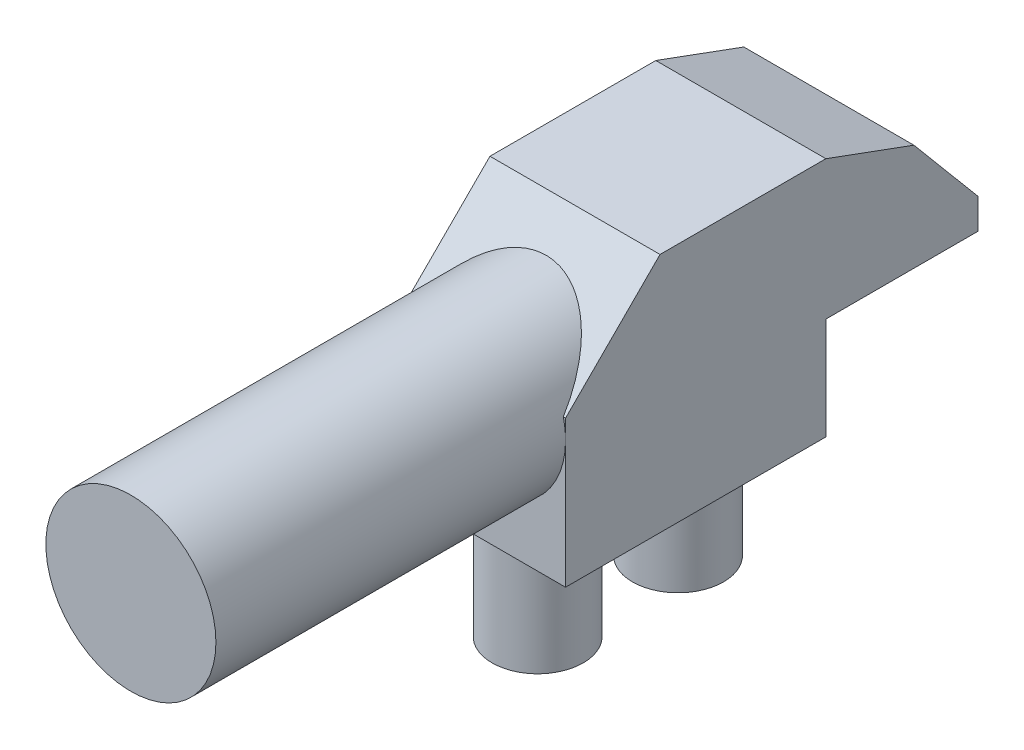
ISO-10303-21;
HEADER;
FILE_DESCRIPTION(('STEP AP214'),'2;1');
FILE_NAME('part.step','',(''),(''),'','','');
FILE_SCHEMA(('AUTOMOTIVE_DESIGN { 1 0 10303 214 1 1 1 1 }'));
ENDSEC;
DATA;
#1=APPLICATION_CONTEXT('core data for automotive mechanical design processes');
#2=APPLICATION_PROTOCOL_DEFINITION('international standard','automotive_design',2000,#1);
#3=PRODUCT_CONTEXT('',#1,'mechanical');
#4=PRODUCT('Part','Part','',(#3));
#5=PRODUCT_RELATED_PRODUCT_CATEGORY('part','',(#4));
#6=PRODUCT_DEFINITION_FORMATION('','',#4);
#7=PRODUCT_DEFINITION_CONTEXT('part definition',#1,'design');
#8=PRODUCT_DEFINITION('design','',#6,#7);
#9=PRODUCT_DEFINITION_SHAPE('','',#8);
#10=(LENGTH_UNIT() NAMED_UNIT(*) SI_UNIT(.MILLI.,.METRE.));
#11=(NAMED_UNIT(*) PLANE_ANGLE_UNIT() SI_UNIT($,.RADIAN.));
#12=(NAMED_UNIT(*) SI_UNIT($,.STERADIAN.) SOLID_ANGLE_UNIT());
#13=UNCERTAINTY_MEASURE_WITH_UNIT(LENGTH_MEASURE(1.E-05),#10,'distance_accuracy_value','');
#14=(GEOMETRIC_REPRESENTATION_CONTEXT(3) GLOBAL_UNCERTAINTY_ASSIGNED_CONTEXT((#13)) GLOBAL_UNIT_ASSIGNED_CONTEXT((#10,
#11,#12)) REPRESENTATION_CONTEXT('',''));
#15=CARTESIAN_POINT('',(0.,0.,0.));
#16=DIRECTION('',(0.,0.,1.));
#17=DIRECTION('',(1.,0.,0.));
#18=AXIS2_PLACEMENT_3D('',#15,#16,#17);
#19=CARTESIAN_POINT('',(-1.8,-2.69,2.755));
#20=DIRECTION('',(0.,0.,1.));
#21=DIRECTION('',(1.,0.,0.));
#22=AXIS2_PLACEMENT_3D('',#19,#20,#21);
#23=PLANE('',#22);
#24=DIRECTION('',(0.,1.,0.));
#25=VECTOR('',#24,1.);
#26=CARTESIAN_POINT('',(1.8,-2.69,2.755));
#27=LINE('',#26,#25);
#28=CARTESIAN_POINT('',(1.8,0.,2.755));
#29=VERTEX_POINT('',#28);
#30=CARTESIAN_POINT('',(1.8,0.409999999999985,2.755));
#31=VERTEX_POINT('',#30);
#32=EDGE_CURVE('E194',#29,#31,#27,.T.);
#33=ORIENTED_EDGE('',*,*,#32,.T.);
#34=DIRECTION('',(-1.,0.,0.));
#35=VECTOR('',#34,1.);
#36=CARTESIAN_POINT('',(-1.8,0.409999999999985,2.755));
#37=LINE('',#36,#35);
#38=CARTESIAN_POINT('',(1.75268365656784,0.409999999999985,2.755));
#39=VERTEX_POINT('',#38);
#40=EDGE_CURVE('E215',#31,#39,#37,.T.);
#41=ORIENTED_EDGE('',*,*,#40,.T.);
#42=CARTESIAN_POINT('',(0.,0.,2.755));
#43=DIRECTION('',(0.,0.,1.));
#44=DIRECTION('',(1.,0.,0.));
#45=AXIS2_PLACEMENT_3D('',#42,#43,#44);
#46=CIRCLE('',#45,1.8);
#47=EDGE_CURVE('E170',#29,#39,#46,.T.);
#48=ORIENTED_EDGE('',*,*,#47,.F.);
#49=EDGE_LOOP('',(#33,#41,#48));
#50=FACE_BOUND('',#49,.T.);
#51=ADVANCED_FACE('F32',(#50),#23,.T.);
#52=CARTESIAN_POINT('',(-1.75268365656784,0.409999999999985,2.755));
#53=VERTEX_POINT('',#52);
#54=CARTESIAN_POINT('',(-1.8,0.,2.755));
#55=VERTEX_POINT('',#54);
#56=EDGE_CURVE('E165',#53,#55,#46,.T.);
#57=ORIENTED_EDGE('',*,*,#56,.F.);
#58=DIRECTION('',(-1.,0.,0.));
#59=VECTOR('',#58,1.);
#60=CARTESIAN_POINT('',(-1.8,0.409999999999985,2.755));
#61=LINE('',#60,#59);
#62=CARTESIAN_POINT('',(-1.8,0.409999999999985,2.755));
#63=VERTEX_POINT('',#62);
#64=EDGE_CURVE('E47',#53,#63,#61,.T.);
#65=ORIENTED_EDGE('',*,*,#64,.T.);
#66=DIRECTION('',(0.,1.,0.));
#67=VECTOR('',#66,1.);
#68=CARTESIAN_POINT('',(-1.8,-2.69,2.755));
#69=LINE('',#68,#67);
#70=EDGE_CURVE('E198',#55,#63,#69,.T.);
#71=ORIENTED_EDGE('',*,*,#70,.F.);
#72=EDGE_LOOP('',(#57,#65,#71));
#73=FACE_BOUND('',#72,.T.);
#74=ADVANCED_FACE('F236',(#73),#23,.T.);
#75=CARTESIAN_POINT('',(1.8,-2.69,-2.755));
#76=DIRECTION('',(1.,0.,0.));
#77=DIRECTION('',(0.,0.,-1.));
#78=AXIS2_PLACEMENT_3D('',#75,#76,#77);
#79=PLANE('',#78);
#80=DIRECTION('',(0.,0.,-1.));
#81=VECTOR('',#80,1.);
#82=CARTESIAN_POINT('',(1.8,2.41,-2.755));
#83=LINE('',#82,#81);
#84=CARTESIAN_POINT('',(1.8,2.41,0.754999999999965));
#85=VERTEX_POINT('',#84);
#86=CARTESIAN_POINT('',(1.8,2.41,-2.755));
#87=VERTEX_POINT('',#86);
#88=EDGE_CURVE('E169',#85,#87,#83,.T.);
#89=ORIENTED_EDGE('',*,*,#88,.F.);
#90=DIRECTION('',(0.,0.707106781186544,-0.707106781186551));
#91=VECTOR('',#90,1.);
#92=CARTESIAN_POINT('',(1.8,1.61500000000001,1.54999999999996));
#93=LINE('',#92,#91);
#94=EDGE_CURVE('E212',#85,#31,#93,.F.);
#95=ORIENTED_EDGE('',*,*,#94,.T.);
#96=ORIENTED_EDGE('',*,*,#32,.F.);
#97=CARTESIAN_POINT('',(1.8,-2.69,2.755));
#98=VERTEX_POINT('',#97);
#99=EDGE_CURVE('E192',#98,#29,#27,.T.);
#100=ORIENTED_EDGE('',*,*,#99,.F.);
#101=DIRECTION('',(0.,0.,-1.));
#102=VECTOR('',#101,1.);
#103=CARTESIAN_POINT('',(1.8,-2.69,-2.755));
#104=LINE('',#103,#102);
#105=CARTESIAN_POINT('',(1.8,-2.69,-2.755));
#106=VERTEX_POINT('',#105);
#107=EDGE_CURVE('E179',#98,#106,#104,.T.);
#108=ORIENTED_EDGE('',*,*,#107,.T.);
#109=DIRECTION('',(0.,1.,0.));
#110=VECTOR('',#109,1.);
#111=CARTESIAN_POINT('',(1.8,-2.69,-2.755));
#112=LINE('',#111,#110);
#113=CARTESIAN_POINT('',(1.8,-0.53,-2.755));
#114=VERTEX_POINT('',#113);
#115=EDGE_CURVE('E191',#106,#114,#112,.T.);
#116=ORIENTED_EDGE('',*,*,#115,.T.);
#117=DIRECTION('',(0.,0.,-1.));
#118=VECTOR('',#117,1.);
#119=CARTESIAN_POINT('',(1.8,-0.53,-2.755));
#120=LINE('',#119,#118);
#121=CARTESIAN_POINT('',(1.8,-0.53,-5.975));
#122=VERTEX_POINT('',#121);
#123=EDGE_CURVE('E151',#114,#122,#120,.T.);
#124=ORIENTED_EDGE('',*,*,#123,.T.);
#125=DIRECTION('',(0.,1.,0.));
#126=VECTOR('',#125,1.);
#127=CARTESIAN_POINT('',(1.8,-0.53,-5.975));
#128=LINE('',#127,#126);
#129=CARTESIAN_POINT('',(1.8,0.110868037876924,-5.975));
#130=VERTEX_POINT('',#129);
#131=EDGE_CURVE('E121',#122,#130,#128,.T.);
#132=ORIENTED_EDGE('',*,*,#131,.T.);
#133=DIRECTION('',(0.,0.765791484584354,0.643088953518944));
#134=VECTOR('',#133,1.);
#135=CARTESIAN_POINT('',(1.8,0.110868037876924,-5.975));
#136=LINE('',#135,#134);
#137=CARTESIAN_POINT('',(1.8,1.72627670828322,-4.61842775772589));
#138=VERTEX_POINT('',#137);
#139=EDGE_CURVE('E146',#130,#138,#136,.T.);
#140=ORIENTED_EDGE('',*,*,#139,.T.);
#141=DIRECTION('',(0.,0.344461788400944,0.938800338906854));
#142=VECTOR('',#141,1.);
#143=CARTESIAN_POINT('',(1.8,1.72627670828322,-4.61842775772589));
#144=LINE('',#143,#142);
#145=EDGE_CURVE('E153',#138,#87,#144,.T.);
#146=ORIENTED_EDGE('',*,*,#145,.T.);
#147=EDGE_LOOP('',(#89,#95,#96,#100,#108,#116,#124,#132,#140,#146));
#148=FACE_BOUND('',#147,.T.);
#149=ADVANCED_FACE('F228',(#148),#79,.T.);
#150=EDGE_CURVE('E172',#55,#29,#46,.T.);
#151=ORIENTED_EDGE('',*,*,#150,.F.);
#152=CARTESIAN_POINT('',(-1.8,-2.69,2.755));
#153=VERTEX_POINT('',#152);
#154=EDGE_CURVE('E195',#153,#55,#69,.T.);
#155=ORIENTED_EDGE('',*,*,#154,.F.);
#156=DIRECTION('',(1.,0.,0.));
#157=VECTOR('',#156,1.);
#158=CARTESIAN_POINT('',(-1.8,-2.69,2.755));
#159=LINE('',#158,#157);
#160=EDGE_CURVE('E188',#153,#98,#159,.T.);
#161=ORIENTED_EDGE('',*,*,#160,.T.);
#162=ORIENTED_EDGE('',*,*,#99,.T.);
#163=EDGE_LOOP('',(#151,#155,#161,#162));
#164=FACE_BOUND('',#163,.T.);
#165=ADVANCED_FACE('F235',(#164),#23,.T.);
#166=CARTESIAN_POINT('',(-1.8,-2.69,-2.755));
#167=DIRECTION('',(-1.,0.,0.));
#168=DIRECTION('',(0.,0.,1.));
#169=AXIS2_PLACEMENT_3D('',#166,#167,#168);
#170=PLANE('',#169);
#171=ORIENTED_EDGE('',*,*,#70,.T.);
#172=DIRECTION('',(0.,-0.707106781186544,0.707106781186551));
#173=VECTOR('',#172,1.);
#174=CARTESIAN_POINT('',(-1.8,1.61500000000001,1.54999999999996));
#175=LINE('',#174,#173);
#176=CARTESIAN_POINT('',(-1.8,2.41,0.754999999999965));
#177=VERTEX_POINT('',#176);
#178=EDGE_CURVE('E40',#63,#177,#175,.F.);
#179=ORIENTED_EDGE('',*,*,#178,.T.);
#180=DIRECTION('',(0.,0.,1.));
#181=VECTOR('',#180,1.);
#182=CARTESIAN_POINT('',(-1.8,2.41,-2.755));
#183=LINE('',#182,#181);
#184=CARTESIAN_POINT('',(-1.8,2.41,-2.755));
#185=VERTEX_POINT('',#184);
#186=EDGE_CURVE('E176',#185,#177,#183,.T.);
#187=ORIENTED_EDGE('',*,*,#186,.F.);
#188=DIRECTION('',(0.,0.344461788400944,0.938800338906854));
#189=VECTOR('',#188,1.);
#190=CARTESIAN_POINT('',(-1.8,1.72627670828322,-4.61842775772589));
#191=LINE('',#190,#189);
#192=CARTESIAN_POINT('',(-1.8,1.72627670828322,-4.61842775772589));
#193=VERTEX_POINT('',#192);
#194=EDGE_CURVE('E142',#193,#185,#191,.T.);
#195=ORIENTED_EDGE('',*,*,#194,.F.);
#196=DIRECTION('',(0.,0.765791484584354,0.643088953518944));
#197=VECTOR('',#196,1.);
#198=CARTESIAN_POINT('',(-1.8,0.110868037876924,-5.975));
#199=LINE('',#198,#197);
#200=CARTESIAN_POINT('',(-1.8,0.110868037876924,-5.975));
#201=VERTEX_POINT('',#200);
#202=EDGE_CURVE('E136',#201,#193,#199,.T.);
#203=ORIENTED_EDGE('',*,*,#202,.F.);
#204=DIRECTION('',(0.,1.,0.));
#205=VECTOR('',#204,1.);
#206=CARTESIAN_POINT('',(-1.8,-0.53,-5.975));
#207=LINE('',#206,#205);
#208=CARTESIAN_POINT('',(-1.8,-0.53,-5.975));
#209=VERTEX_POINT('',#208);
#210=EDGE_CURVE('E119',#209,#201,#207,.T.);
#211=ORIENTED_EDGE('',*,*,#210,.F.);
#212=DIRECTION('',(0.,0.,-1.));
#213=VECTOR('',#212,1.);
#214=CARTESIAN_POINT('',(-1.8,-0.53,-2.755));
#215=LINE('',#214,#213);
#216=CARTESIAN_POINT('',(-1.8,-0.53,-2.755));
#217=VERTEX_POINT('',#216);
#218=EDGE_CURVE('E133',#217,#209,#215,.T.);
#219=ORIENTED_EDGE('',*,*,#218,.F.);
#220=DIRECTION('',(0.,1.,0.));
#221=VECTOR('',#220,1.);
#222=CARTESIAN_POINT('',(-1.8,-2.69,-2.755));
#223=LINE('',#222,#221);
#224=CARTESIAN_POINT('',(-1.8,-2.69,-2.755));
#225=VERTEX_POINT('',#224);
#226=EDGE_CURVE('E199',#225,#217,#223,.T.);
#227=ORIENTED_EDGE('',*,*,#226,.F.);
#228=DIRECTION('',(0.,0.,1.));
#229=VECTOR('',#228,1.);
#230=CARTESIAN_POINT('',(-1.8,-2.69,-2.755));
#231=LINE('',#230,#229);
#232=EDGE_CURVE('E185',#225,#153,#231,.T.);
#233=ORIENTED_EDGE('',*,*,#232,.T.);
#234=ORIENTED_EDGE('',*,*,#154,.T.);
#235=EDGE_LOOP('',(#171,#179,#187,#195,#203,#211,#219,#227,#233,#234));
#236=FACE_BOUND('',#235,.T.);
#237=ADVANCED_FACE('F132',(#236),#170,.T.);
#238=CARTESIAN_POINT('',(-1.8,-2.69,-2.755));
#239=DIRECTION('',(0.,0.,-1.));
#240=DIRECTION('',(-1.,0.,0.));
#241=AXIS2_PLACEMENT_3D('',#238,#239,#240);
#242=PLANE('',#241);
#243=DIRECTION('',(-1.,0.,0.));
#244=VECTOR('',#243,1.);
#245=CARTESIAN_POINT('',(6.16027522067128,-0.53,-2.755));
#246=LINE('',#245,#244);
#247=EDGE_CURVE('E127',#114,#217,#246,.T.);
#248=ORIENTED_EDGE('',*,*,#247,.F.);
#249=ORIENTED_EDGE('',*,*,#115,.F.);
#250=DIRECTION('',(-1.,0.,0.));
#251=VECTOR('',#250,1.);
#252=CARTESIAN_POINT('',(-1.8,-2.69,-2.755));
#253=LINE('',#252,#251);
#254=EDGE_CURVE('E182',#106,#225,#253,.T.);
#255=ORIENTED_EDGE('',*,*,#254,.T.);
#256=ORIENTED_EDGE('',*,*,#226,.T.);
#257=EDGE_LOOP('',(#248,#249,#255,#256));
#258=FACE_BOUND('',#257,.T.);
#259=ADVANCED_FACE('F244',(#258),#242,.T.);
#260=CARTESIAN_POINT('',(0.,-2.69,0.));
#261=DIRECTION('',(0.,1.,0.));
#262=DIRECTION('',(0.,0.,1.));
#263=AXIS2_PLACEMENT_3D('',#260,#261,#262);
#264=PLANE('',#263);
#265=CARTESIAN_POINT('',(0.,-2.69,-1.425));
#266=DIRECTION('',(0.,1.,0.));
#267=DIRECTION('',(0.,0.,1.));
#268=AXIS2_PLACEMENT_3D('',#265,#266,#267);
#269=CIRCLE('',#268,0.965);
#270=CARTESIAN_POINT('',(0.,-2.69,-0.459999999999999));
#271=VERTEX_POINT('',#270);
#272=EDGE_CURVE('E206',#271,#271,#269,.F.);
#273=ORIENTED_EDGE('',*,*,#272,.F.);
#274=EDGE_LOOP('',(#273));
#275=FACE_BOUND('',#274,.T.);
#276=CARTESIAN_POINT('',(0.,-2.69,1.545));
#277=DIRECTION('',(0.,1.,0.));
#278=DIRECTION('',(0.,0.,1.));
#279=AXIS2_PLACEMENT_3D('',#276,#277,#278);
#280=CIRCLE('',#279,0.965);
#281=CARTESIAN_POINT('',(0.,-2.69,2.51));
#282=VERTEX_POINT('',#281);
#283=EDGE_CURVE('E203',#282,#282,#280,.F.);
#284=ORIENTED_EDGE('',*,*,#283,.F.);
#285=EDGE_LOOP('',(#284));
#286=FACE_BOUND('',#285,.T.);
#287=ORIENTED_EDGE('',*,*,#107,.F.);
#288=ORIENTED_EDGE('',*,*,#160,.F.);
#289=ORIENTED_EDGE('',*,*,#232,.F.);
#290=ORIENTED_EDGE('',*,*,#254,.F.);
#291=EDGE_LOOP('',(#287,#288,#289,#290));
#292=FACE_BOUND('',#291,.T.);
#293=ADVANCED_FACE('F242',(#275,#286,#292),#264,.F.);
#294=CARTESIAN_POINT('',(0.,2.41,0.));
#295=DIRECTION('',(0.,1.,0.));
#296=DIRECTION('',(0.,0.,1.));
#297=AXIS2_PLACEMENT_3D('',#294,#295,#296);
#298=PLANE('',#297);
#299=ORIENTED_EDGE('',*,*,#186,.T.);
#300=DIRECTION('',(1.,0.,0.));
#301=VECTOR('',#300,1.);
#302=CARTESIAN_POINT('',(0.,2.41,0.754999999999965));
#303=LINE('',#302,#301);
#304=EDGE_CURVE('E209',#177,#85,#303,.T.);
#305=ORIENTED_EDGE('',*,*,#304,.T.);
#306=ORIENTED_EDGE('',*,*,#88,.T.);
#307=DIRECTION('',(-1.,0.,0.));
#308=VECTOR('',#307,1.);
#309=CARTESIAN_POINT('',(-1.8,2.41,-2.755));
#310=LINE('',#309,#308);
#311=EDGE_CURVE('E174',#87,#185,#310,.T.);
#312=ORIENTED_EDGE('',*,*,#311,.T.);
#313=EDGE_LOOP('',(#299,#305,#306,#312));
#314=FACE_BOUND('',#313,.T.);
#315=ADVANCED_FACE('F221',(#314),#298,.T.);
#316=CARTESIAN_POINT('',(0.,0.,10.155));
#317=DIRECTION('',(0.,0.,-1.));
#318=DIRECTION('',(-1.,0.,0.));
#319=AXIS2_PLACEMENT_3D('',#316,#317,#318);
#320=CYLINDRICAL_SURFACE('',#319,1.8);
#321=CARTESIAN_POINT('',(0.,0.,10.155));
#322=DIRECTION('',(0.,0.,1.));
#323=DIRECTION('',(1.,0.,0.));
#324=AXIS2_PLACEMENT_3D('',#321,#322,#323);
#325=CIRCLE('',#324,1.8);
#326=CARTESIAN_POINT('',(1.8,0.,10.155));
#327=VERTEX_POINT('',#326);
#328=EDGE_CURVE('E166',#327,#327,#325,.T.);
#329=ORIENTED_EDGE('',*,*,#328,.F.);
#330=EDGE_LOOP('',(#329));
#331=FACE_BOUND('',#330,.T.);
#332=ORIENTED_EDGE('',*,*,#47,.T.);
#333=CARTESIAN_POINT('',(0.,0.,3.16499999999999));
#334=DIRECTION('',(0.,-0.707106781186551,-0.707106781186544));
#335=DIRECTION('',(0.,0.707106781186544,-0.707106781186551));
#336=AXIS2_PLACEMENT_3D('',#333,#334,#335);
#337=ELLIPSE('',#336,2.54558441227158,1.8);
#338=EDGE_CURVE('E11',#39,#53,#337,.F.);
#339=ORIENTED_EDGE('',*,*,#338,.T.);
#340=ORIENTED_EDGE('',*,*,#56,.T.);
#341=ORIENTED_EDGE('',*,*,#150,.T.);
#342=EDGE_LOOP('',(#332,#339,#340,#341));
#343=FACE_BOUND('',#342,.T.);
#344=ADVANCED_FACE('F233',(#331,#343),#320,.T.);
#345=CARTESIAN_POINT('',(0.,0.,10.155));
#346=DIRECTION('',(0.,0.,1.));
#347=DIRECTION('',(1.,0.,0.));
#348=AXIS2_PLACEMENT_3D('',#345,#346,#347);
#349=PLANE('',#348);
#350=ORIENTED_EDGE('',*,*,#328,.T.);
#351=EDGE_LOOP('',(#350));
#352=FACE_BOUND('',#351,.T.);
#353=ADVANCED_FACE('F361',(#352),#349,.T.);
#354=CARTESIAN_POINT('',(0.,-5.1,1.545));
#355=DIRECTION('',(0.,1.,0.));
#356=DIRECTION('',(0.,0.,1.));
#357=AXIS2_PLACEMENT_3D('',#354,#355,#356);
#358=CYLINDRICAL_SURFACE('',#357,0.965);
#359=CARTESIAN_POINT('',(0.,-5.1,1.545));
#360=DIRECTION('',(0.,-1.,0.));
#361=DIRECTION('',(0.,0.,-1.));
#362=AXIS2_PLACEMENT_3D('',#359,#360,#361);
#363=CIRCLE('',#362,0.965);
#364=CARTESIAN_POINT('',(0.,-5.1,0.580000000000001));
#365=VERTEX_POINT('',#364);
#366=EDGE_CURVE('E162',#365,#365,#363,.T.);
#367=ORIENTED_EDGE('',*,*,#366,.F.);
#368=EDGE_LOOP('',(#367));
#369=FACE_BOUND('',#368,.T.);
#370=ORIENTED_EDGE('',*,*,#283,.T.);
#371=EDGE_LOOP('',(#370));
#372=FACE_BOUND('',#371,.T.);
#373=ADVANCED_FACE('F351',(#369,#372),#358,.T.);
#374=CARTESIAN_POINT('',(0.,-5.1,1.545));
#375=DIRECTION('',(0.,-1.,0.));
#376=DIRECTION('',(0.,0.,-1.));
#377=AXIS2_PLACEMENT_3D('',#374,#375,#376);
#378=PLANE('',#377);
#379=ORIENTED_EDGE('',*,*,#366,.T.);
#380=EDGE_LOOP('',(#379));
#381=FACE_BOUND('',#380,.T.);
#382=ADVANCED_FACE('F341',(#381),#378,.T.);
#383=CARTESIAN_POINT('',(0.,-5.1,-1.425));
#384=DIRECTION('',(0.,1.,0.));
#385=DIRECTION('',(0.,0.,1.));
#386=AXIS2_PLACEMENT_3D('',#383,#384,#385);
#387=CYLINDRICAL_SURFACE('',#386,0.965);
#388=CARTESIAN_POINT('',(0.,-5.1,-1.425));
#389=DIRECTION('',(0.,-1.,0.));
#390=DIRECTION('',(0.,0.,-1.));
#391=AXIS2_PLACEMENT_3D('',#388,#389,#390);
#392=CIRCLE('',#391,0.965);
#393=CARTESIAN_POINT('',(0.,-5.1,-2.39));
#394=VERTEX_POINT('',#393);
#395=EDGE_CURVE('E149',#394,#394,#392,.T.);
#396=ORIENTED_EDGE('',*,*,#395,.F.);
#397=EDGE_LOOP('',(#396));
#398=FACE_BOUND('',#397,.T.);
#399=ORIENTED_EDGE('',*,*,#272,.T.);
#400=EDGE_LOOP('',(#399));
#401=FACE_BOUND('',#400,.T.);
#402=ADVANCED_FACE('F331',(#398,#401),#387,.T.);
#403=CARTESIAN_POINT('',(0.,-5.1,-1.425));
#404=DIRECTION('',(0.,-1.,0.));
#405=DIRECTION('',(0.,0.,-1.));
#406=AXIS2_PLACEMENT_3D('',#403,#404,#405);
#407=PLANE('',#406);
#408=ORIENTED_EDGE('',*,*,#395,.T.);
#409=EDGE_LOOP('',(#408));
#410=FACE_BOUND('',#409,.T.);
#411=ADVANCED_FACE('F314',(#410),#407,.T.);
#412=CARTESIAN_POINT('',(6.16027522067128,-0.53,-2.755));
#413=DIRECTION('',(0.,1.,0.));
#414=DIRECTION('',(0.,0.,1.));
#415=AXIS2_PLACEMENT_3D('',#412,#413,#414);
#416=PLANE('',#415);
#417=ORIENTED_EDGE('',*,*,#123,.F.);
#418=ORIENTED_EDGE('',*,*,#247,.T.);
#419=ORIENTED_EDGE('',*,*,#218,.T.);
#420=DIRECTION('',(-1.,0.,0.));
#421=VECTOR('',#420,1.);
#422=CARTESIAN_POINT('',(6.16027522067128,-0.53,-5.975));
#423=LINE('',#422,#421);
#424=EDGE_CURVE('E115',#122,#209,#423,.T.);
#425=ORIENTED_EDGE('',*,*,#424,.F.);
#426=EDGE_LOOP('',(#417,#418,#419,#425));
#427=FACE_BOUND('',#426,.T.);
#428=ADVANCED_FACE('F139',(#427),#416,.F.);
#429=CARTESIAN_POINT('',(6.16027522067128,-0.53,-5.975));
#430=DIRECTION('',(0.,0.,1.));
#431=DIRECTION('',(1.,0.,0.));
#432=AXIS2_PLACEMENT_3D('',#429,#430,#431);
#433=PLANE('',#432);
#434=ORIENTED_EDGE('',*,*,#131,.F.);
#435=ORIENTED_EDGE('',*,*,#424,.T.);
#436=ORIENTED_EDGE('',*,*,#210,.T.);
#437=DIRECTION('',(-1.,0.,0.));
#438=VECTOR('',#437,1.);
#439=CARTESIAN_POINT('',(6.16027522067128,0.110868037876924,-5.975));
#440=LINE('',#439,#438);
#441=EDGE_CURVE('E126',#130,#201,#440,.T.);
#442=ORIENTED_EDGE('',*,*,#441,.F.);
#443=EDGE_LOOP('',(#434,#435,#436,#442));
#444=FACE_BOUND('',#443,.T.);
#445=ADVANCED_FACE('F117',(#444),#433,.F.);
#446=CARTESIAN_POINT('',(6.16027522067128,0.110868037876924,-5.975));
#447=DIRECTION('',(0.,-0.643088953518944,0.765791484584354));
#448=DIRECTION('',(0.,-0.765791484584354,-0.643088953518944));
#449=AXIS2_PLACEMENT_3D('',#446,#447,#448);
#450=PLANE('',#449);
#451=ORIENTED_EDGE('',*,*,#139,.F.);
#452=ORIENTED_EDGE('',*,*,#441,.T.);
#453=ORIENTED_EDGE('',*,*,#202,.T.);
#454=DIRECTION('',(-1.,0.,0.));
#455=VECTOR('',#454,1.);
#456=CARTESIAN_POINT('',(6.16027522067128,1.72627670828322,-4.61842775772589));
#457=LINE('',#456,#455);
#458=EDGE_CURVE('E156',#138,#193,#457,.T.);
#459=ORIENTED_EDGE('',*,*,#458,.F.);
#460=EDGE_LOOP('',(#451,#452,#453,#459));
#461=FACE_BOUND('',#460,.T.);
#462=ADVANCED_FACE('F287',(#461),#450,.F.);
#463=CARTESIAN_POINT('',(6.16027522067128,1.72627670828322,-4.61842775772589));
#464=DIRECTION('',(0.,-0.938800338906854,0.344461788400944));
#465=DIRECTION('',(0.,-0.344461788400944,-0.938800338906854));
#466=AXIS2_PLACEMENT_3D('',#463,#464,#465);
#467=PLANE('',#466);
#468=ORIENTED_EDGE('',*,*,#145,.F.);
#469=ORIENTED_EDGE('',*,*,#458,.T.);
#470=ORIENTED_EDGE('',*,*,#194,.T.);
#471=ORIENTED_EDGE('',*,*,#311,.F.);
#472=EDGE_LOOP('',(#468,#469,#470,#471));
#473=FACE_BOUND('',#472,.T.);
#474=ADVANCED_FACE('F283',(#473),#467,.F.);
#475=CARTESIAN_POINT('',(0.,2.41,0.754999999999965));
#476=DIRECTION('',(0.,-0.707106781186551,-0.707106781186544));
#477=DIRECTION('',(1.,0.,0.));
#478=AXIS2_PLACEMENT_3D('',#475,#476,#477);
#479=PLANE('',#478);
#480=ORIENTED_EDGE('',*,*,#338,.F.);
#481=ORIENTED_EDGE('',*,*,#40,.F.);
#482=ORIENTED_EDGE('',*,*,#94,.F.);
#483=ORIENTED_EDGE('',*,*,#304,.F.);
#484=ORIENTED_EDGE('',*,*,#178,.F.);
#485=ORIENTED_EDGE('',*,*,#64,.F.);
#486=EDGE_LOOP('',(#480,#481,#482,#483,#484,#485));
#487=FACE_BOUND('',#486,.T.);
#488=ADVANCED_FACE('F34',(#487),#479,.F.);
#489=CLOSED_SHELL('',(#51,#74,#149,#165,#237,#259,#293,#315,#344,#353,#373,#382,#402,#411,#428,
#445,#462,#474,#488));
#490=MANIFOLD_SOLID_BREP('B2',#489);
#491=ADVANCED_BREP_SHAPE_REPRESENTATION('',(#18,#490),#14);
#492=SHAPE_DEFINITION_REPRESENTATION(#9,#491);
ENDSEC;
END-ISO-10303-21;
